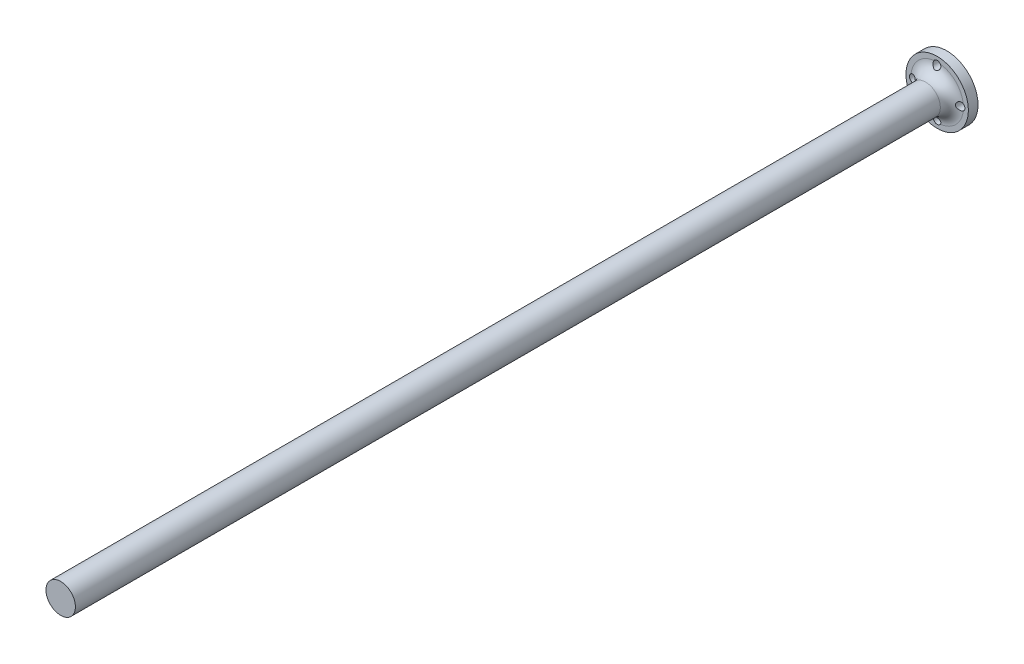
ISO-10303-21;
HEADER;
FILE_DESCRIPTION(('STEP AP214'),'2;1');
FILE_NAME('part.step','',(''),(''),'','','');
FILE_SCHEMA(('AUTOMOTIVE_DESIGN { 1 0 10303 214 1 1 1 1 }'));
ENDSEC;
DATA;
#1=APPLICATION_CONTEXT('core data for automotive mechanical design processes');
#2=APPLICATION_PROTOCOL_DEFINITION('international standard','automotive_design',2000,#1);
#3=PRODUCT_CONTEXT('',#1,'mechanical');
#4=PRODUCT('Part','Part','',(#3));
#5=PRODUCT_RELATED_PRODUCT_CATEGORY('part','',(#4));
#6=PRODUCT_DEFINITION_FORMATION('','',#4);
#7=PRODUCT_DEFINITION_CONTEXT('part definition',#1,'design');
#8=PRODUCT_DEFINITION('design','',#6,#7);
#9=PRODUCT_DEFINITION_SHAPE('','',#8);
#10=(LENGTH_UNIT() NAMED_UNIT(*) SI_UNIT(.MILLI.,.METRE.));
#11=(NAMED_UNIT(*) PLANE_ANGLE_UNIT() SI_UNIT($,.RADIAN.));
#12=(NAMED_UNIT(*) SI_UNIT($,.STERADIAN.) SOLID_ANGLE_UNIT());
#13=UNCERTAINTY_MEASURE_WITH_UNIT(LENGTH_MEASURE(1.E-05),#10,'distance_accuracy_value','');
#14=(GEOMETRIC_REPRESENTATION_CONTEXT(3) GLOBAL_UNCERTAINTY_ASSIGNED_CONTEXT((#13)) GLOBAL_UNIT_ASSIGNED_CONTEXT((#10,
#11,#12)) REPRESENTATION_CONTEXT('',''));
#15=CARTESIAN_POINT('',(0.,0.,0.));
#16=DIRECTION('',(0.,0.,1.));
#17=DIRECTION('',(1.,0.,0.));
#18=AXIS2_PLACEMENT_3D('',#15,#16,#17);
#19=CARTESIAN_POINT('',(0.,0.,3.175));
#20=DIRECTION('',(0.,0.,-1.));
#21=DIRECTION('',(-1.,0.,0.));
#22=AXIS2_PLACEMENT_3D('',#19,#20,#21);
#23=CYLINDRICAL_SURFACE('',#22,10.287);
#24=CARTESIAN_POINT('',(0.,0.,3.175));
#25=DIRECTION('',(0.,0.,1.));
#26=DIRECTION('',(1.,0.,0.));
#27=AXIS2_PLACEMENT_3D('',#24,#25,#26);
#28=CIRCLE('',#27,10.287);
#29=CARTESIAN_POINT('',(10.287,0.,3.175));
#30=VERTEX_POINT('',#29);
#31=EDGE_CURVE('E185',#30,#30,#28,.T.);
#32=ORIENTED_EDGE('',*,*,#31,.F.);
#33=EDGE_LOOP('',(#32));
#34=FACE_BOUND('',#33,.T.);
#35=CARTESIAN_POINT('',(0.,0.,0.));
#36=DIRECTION('',(0.,0.,1.));
#37=DIRECTION('',(1.,0.,0.));
#38=AXIS2_PLACEMENT_3D('',#35,#36,#37);
#39=CIRCLE('',#38,10.287);
#40=CARTESIAN_POINT('',(10.287,0.,0.));
#41=VERTEX_POINT('',#40);
#42=EDGE_CURVE('E190',#41,#41,#39,.T.);
#43=ORIENTED_EDGE('',*,*,#42,.T.);
#44=EDGE_LOOP('',(#43));
#45=FACE_BOUND('',#44,.T.);
#46=ADVANCED_FACE('F39',(#34,#45),#23,.T.);
#47=CARTESIAN_POINT('',(0.,0.,3.175));
#48=DIRECTION('',(0.,0.,1.));
#49=DIRECTION('',(1.,0.,0.));
#50=AXIS2_PLACEMENT_3D('',#47,#48,#49);
#51=PLANE('',#50);
#52=CARTESIAN_POINT('',(0.,-7.874,3.17499999999998));
#53=DIRECTION('',(0.,0.,1.));
#54=DIRECTION('',(1.,0.,0.));
#55=AXIS2_PLACEMENT_3D('',#52,#53,#54);
#56=CIRCLE('',#55,1.27);
#57=CARTESIAN_POINT('',(1.0431759884384,-8.59835064516129,3.17499999999998));
#58=VERTEX_POINT('',#57);
#59=CARTESIAN_POINT('',(-1.0431759884384,-8.59835064516129,3.17499999999998));
#60=VERTEX_POINT('',#59);
#61=EDGE_CURVE('E218',#58,#60,#56,.F.);
#62=ORIENTED_EDGE('',*,*,#61,.T.);
#63=CARTESIAN_POINT('',(0.,0.,3.175));
#64=DIRECTION('',(0.,0.,1.));
#65=DIRECTION('',(1.,0.,0.));
#66=AXIS2_PLACEMENT_3D('',#63,#64,#65);
#67=CIRCLE('',#66,8.6614);
#68=CARTESIAN_POINT('',(-8.5983506451613,-1.04317598843831,3.17499999999998));
#69=VERTEX_POINT('',#68);
#70=EDGE_CURVE('E121',#60,#69,#67,.F.);
#71=ORIENTED_EDGE('',*,*,#70,.T.);
#72=CARTESIAN_POINT('',(-7.874,0.,3.17499999999998));
#73=DIRECTION('',(0.,0.,1.));
#74=DIRECTION('',(1.,0.,0.));
#75=AXIS2_PLACEMENT_3D('',#72,#73,#74);
#76=CIRCLE('',#75,1.27);
#77=CARTESIAN_POINT('',(-8.59835064516128,1.04317598843849,3.17499999999998));
#78=VERTEX_POINT('',#77);
#79=EDGE_CURVE('E211',#69,#78,#76,.F.);
#80=ORIENTED_EDGE('',*,*,#79,.T.);
#81=CARTESIAN_POINT('',(0.,0.,3.175));
#82=DIRECTION('',(0.,0.,1.));
#83=DIRECTION('',(1.,0.,0.));
#84=AXIS2_PLACEMENT_3D('',#81,#82,#83);
#85=CIRCLE('',#84,8.6614);
#86=CARTESIAN_POINT('',(-1.0431759884384,8.59835064516129,3.17499999999998));
#87=VERTEX_POINT('',#86);
#88=EDGE_CURVE('E67',#78,#87,#85,.F.);
#89=ORIENTED_EDGE('',*,*,#88,.T.);
#90=CARTESIAN_POINT('',(0.,7.874,3.17499999999998));
#91=DIRECTION('',(0.,0.,1.));
#92=DIRECTION('',(1.,0.,0.));
#93=AXIS2_PLACEMENT_3D('',#90,#91,#92);
#94=CIRCLE('',#93,1.27);
#95=CARTESIAN_POINT('',(1.0431759884384,8.59835064516129,3.17499999999998));
#96=VERTEX_POINT('',#95);
#97=EDGE_CURVE('E205',#87,#96,#94,.F.);
#98=ORIENTED_EDGE('',*,*,#97,.T.);
#99=CARTESIAN_POINT('',(0.,0.,3.175));
#100=DIRECTION('',(0.,0.,1.));
#101=DIRECTION('',(1.,0.,0.));
#102=AXIS2_PLACEMENT_3D('',#99,#100,#101);
#103=CIRCLE('',#102,8.6614);
#104=CARTESIAN_POINT('',(8.59835064516129,1.04317598843837,3.17499999999998));
#105=VERTEX_POINT('',#104);
#106=EDGE_CURVE('E100',#96,#105,#103,.F.);
#107=ORIENTED_EDGE('',*,*,#106,.T.);
#108=CARTESIAN_POINT('',(7.874,0.,3.17499999999998));
#109=DIRECTION('',(0.,0.,1.));
#110=DIRECTION('',(1.,0.,0.));
#111=AXIS2_PLACEMENT_3D('',#108,#109,#110);
#112=CIRCLE('',#111,1.27);
#113=CARTESIAN_POINT('',(8.59835064516129,-1.04317598843843,3.17499999999998));
#114=VERTEX_POINT('',#113);
#115=EDGE_CURVE('E90',#105,#114,#112,.F.);
#116=ORIENTED_EDGE('',*,*,#115,.T.);
#117=CARTESIAN_POINT('',(0.,0.,3.175));
#118=DIRECTION('',(0.,0.,1.));
#119=DIRECTION('',(1.,0.,0.));
#120=AXIS2_PLACEMENT_3D('',#117,#118,#119);
#121=CIRCLE('',#120,8.6614);
#122=EDGE_CURVE('E98',#114,#58,#121,.F.);
#123=ORIENTED_EDGE('',*,*,#122,.T.);
#124=EDGE_LOOP('',(#62,#71,#80,#89,#98,#107,#116,#123));
#125=FACE_BOUND('',#124,.T.);
#126=ORIENTED_EDGE('',*,*,#31,.T.);
#127=EDGE_LOOP('',(#126));
#128=FACE_BOUND('',#127,.T.);
#129=ADVANCED_FACE('F96',(#125,#128),#51,.T.);
#130=CARTESIAN_POINT('',(0.,0.,0.));
#131=DIRECTION('',(0.,0.,1.));
#132=DIRECTION('',(1.,0.,0.));
#133=AXIS2_PLACEMENT_3D('',#130,#131,#132);
#134=PLANE('',#133);
#135=CARTESIAN_POINT('',(7.874,0.,0.));
#136=DIRECTION('',(0.,0.,-1.));
#137=DIRECTION('',(0.,1.,0.));
#138=AXIS2_PLACEMENT_3D('',#135,#136,#137);
#139=CIRCLE('',#138,1.27);
#140=CARTESIAN_POINT('',(7.874,1.26999999999997,0.));
#141=VERTEX_POINT('',#140);
#142=EDGE_CURVE('E102',#141,#141,#139,.T.);
#143=ORIENTED_EDGE('',*,*,#142,.F.);
#144=EDGE_LOOP('',(#143));
#145=FACE_BOUND('',#144,.T.);
#146=CARTESIAN_POINT('',(0.,-7.874,0.));
#147=DIRECTION('',(0.,0.,-1.));
#148=DIRECTION('',(1.,0.,0.));
#149=AXIS2_PLACEMENT_3D('',#146,#147,#148);
#150=CIRCLE('',#149,1.27);
#151=CARTESIAN_POINT('',(1.27,-7.874,0.));
#152=VERTEX_POINT('',#151);
#153=EDGE_CURVE('E103',#152,#152,#150,.T.);
#154=ORIENTED_EDGE('',*,*,#153,.F.);
#155=EDGE_LOOP('',(#154));
#156=FACE_BOUND('',#155,.T.);
#157=CARTESIAN_POINT('',(-7.874,0.,0.));
#158=DIRECTION('',(0.,0.,-1.));
#159=DIRECTION('',(0.,-1.,0.));
#160=AXIS2_PLACEMENT_3D('',#157,#158,#159);
#161=CIRCLE('',#160,1.27);
#162=CARTESIAN_POINT('',(-7.87400000000001,-1.26999999999992,0.));
#163=VERTEX_POINT('',#162);
#164=EDGE_CURVE('E214',#163,#163,#161,.T.);
#165=ORIENTED_EDGE('',*,*,#164,.F.);
#166=EDGE_LOOP('',(#165));
#167=FACE_BOUND('',#166,.T.);
#168=CARTESIAN_POINT('',(0.,7.874,0.));
#169=DIRECTION('',(0.,0.,-1.));
#170=DIRECTION('',(-1.,0.,0.));
#171=AXIS2_PLACEMENT_3D('',#168,#169,#170);
#172=CIRCLE('',#171,1.27);
#173=CARTESIAN_POINT('',(-1.27,7.874,0.));
#174=VERTEX_POINT('',#173);
#175=EDGE_CURVE('E204',#174,#174,#172,.T.);
#176=ORIENTED_EDGE('',*,*,#175,.F.);
#177=EDGE_LOOP('',(#176));
#178=FACE_BOUND('',#177,.T.);
#179=CARTESIAN_POINT('',(0.,0.,0.));
#180=DIRECTION('',(0.,0.,1.));
#181=DIRECTION('',(1.,0.,0.));
#182=AXIS2_PLACEMENT_3D('',#179,#180,#181);
#183=CIRCLE('',#182,5.064000032);
#184=CARTESIAN_POINT('',(5.064000032,0.,0.));
#185=VERTEX_POINT('',#184);
#186=EDGE_CURVE('E115',#185,#185,#183,.T.);
#187=ORIENTED_EDGE('',*,*,#186,.T.);
#188=EDGE_LOOP('',(#187));
#189=FACE_BOUND('',#188,.T.);
#190=ORIENTED_EDGE('',*,*,#42,.F.);
#191=EDGE_LOOP('',(#190));
#192=FACE_BOUND('',#191,.T.);
#193=ADVANCED_FACE('F165',(#145,#156,#167,#178,#189,#192),#134,.F.);
#194=CARTESIAN_POINT('',(0.,0.,292.1));
#195=DIRECTION('',(0.,0.,-1.));
#196=DIRECTION('',(-1.,0.,0.));
#197=AXIS2_PLACEMENT_3D('',#194,#195,#196);
#198=CYLINDRICAL_SURFACE('',#197,4.8514);
#199=CARTESIAN_POINT('',(0.,0.,6.98500000000002));
#200=DIRECTION('',(0.,0.,1.));
#201=DIRECTION('',(1.,0.,0.));
#202=AXIS2_PLACEMENT_3D('',#199,#200,#201);
#203=CIRCLE('',#202,4.8514);
#204=CARTESIAN_POINT('',(4.8514,0.,6.98500000000002));
#205=VERTEX_POINT('',#204);
#206=EDGE_CURVE('E109',#205,#205,#203,.T.);
#207=ORIENTED_EDGE('',*,*,#206,.T.);
#208=EDGE_LOOP('',(#207));
#209=FACE_BOUND('',#208,.T.);
#210=CARTESIAN_POINT('',(0.,0.,292.1));
#211=DIRECTION('',(0.,0.,1.));
#212=DIRECTION('',(1.,0.,0.));
#213=AXIS2_PLACEMENT_3D('',#210,#211,#212);
#214=CIRCLE('',#213,4.8514);
#215=CARTESIAN_POINT('',(4.8514,0.,292.1));
#216=VERTEX_POINT('',#215);
#217=EDGE_CURVE('E195',#216,#216,#214,.T.);
#218=ORIENTED_EDGE('',*,*,#217,.F.);
#219=EDGE_LOOP('',(#218));
#220=FACE_BOUND('',#219,.T.);
#221=ADVANCED_FACE('F161',(#209,#220),#198,.T.);
#222=CARTESIAN_POINT('',(0.,0.,292.1));
#223=DIRECTION('',(0.,0.,1.));
#224=DIRECTION('',(1.,0.,0.));
#225=AXIS2_PLACEMENT_3D('',#222,#223,#224);
#226=PLANE('',#225);
#227=ORIENTED_EDGE('',*,*,#217,.T.);
#228=EDGE_LOOP('',(#227));
#229=FACE_BOUND('',#228,.T.);
#230=ADVANCED_FACE('F157',(#229),#226,.T.);
#231=CARTESIAN_POINT('',(0.,0.,1.27));
#232=DIRECTION('',(0.,0.,-1.));
#233=DIRECTION('',(-1.,0.,0.));
#234=AXIS2_PLACEMENT_3D('',#231,#232,#233);
#235=CYLINDRICAL_SURFACE('',#234,4.064);
#236=CARTESIAN_POINT('',(0.,0.,1.000000032));
#237=DIRECTION('',(0.,0.,1.));
#238=DIRECTION('',(1.,0.,0.));
#239=AXIS2_PLACEMENT_3D('',#236,#237,#238);
#240=CIRCLE('',#239,4.064);
#241=CARTESIAN_POINT('',(4.064,0.,1.000000032));
#242=VERTEX_POINT('',#241);
#243=EDGE_CURVE('E183',#242,#242,#240,.F.);
#244=ORIENTED_EDGE('',*,*,#243,.T.);
#245=EDGE_LOOP('',(#244));
#246=FACE_BOUND('',#245,.T.);
#247=CARTESIAN_POINT('',(0.,0.,1.27));
#248=DIRECTION('',(0.,0.,-1.));
#249=DIRECTION('',(-1.,0.,0.));
#250=AXIS2_PLACEMENT_3D('',#247,#248,#249);
#251=CIRCLE('',#250,4.064);
#252=CARTESIAN_POINT('',(-4.064,0.,1.27));
#253=VERTEX_POINT('',#252);
#254=EDGE_CURVE('E200',#253,#253,#251,.T.);
#255=ORIENTED_EDGE('',*,*,#254,.F.);
#256=EDGE_LOOP('',(#255));
#257=FACE_BOUND('',#256,.T.);
#258=ADVANCED_FACE('F153',(#246,#257),#235,.F.);
#259=CARTESIAN_POINT('',(0.,0.,1.27));
#260=DIRECTION('',(0.,0.,-1.));
#261=DIRECTION('',(-1.,0.,0.));
#262=AXIS2_PLACEMENT_3D('',#259,#260,#261);
#263=PLANE('',#262);
#264=ORIENTED_EDGE('',*,*,#254,.T.);
#265=EDGE_LOOP('',(#264));
#266=FACE_BOUND('',#265,.T.);
#267=ADVANCED_FACE('F150',(#266),#263,.T.);
#268=CARTESIAN_POINT('',(0.,0.,1.000000032));
#269=DIRECTION('',(0.,0.,1.));
#270=DIRECTION('',(1.,0.,0.));
#271=AXIS2_PLACEMENT_3D('',#268,#269,#270);
#272=TOROIDAL_SURFACE('',#271,5.064000032,1.000000032);
#273=ORIENTED_EDGE('',*,*,#186,.F.);
#274=EDGE_LOOP('',(#273));
#275=FACE_BOUND('',#274,.T.);
#276=ORIENTED_EDGE('',*,*,#243,.F.);
#277=EDGE_LOOP('',(#276));
#278=FACE_BOUND('',#277,.T.);
#279=ADVANCED_FACE('F149',(#275,#278),#272,.T.);
#280=CARTESIAN_POINT('',(0.,7.874,292.101));
#281=DIRECTION('',(0.,0.,-1.));
#282=DIRECTION('',(-1.,0.,0.));
#283=AXIS2_PLACEMENT_3D('',#280,#281,#282);
#284=CYLINDRICAL_SURFACE('',#283,1.27);
#285=ORIENTED_EDGE('',*,*,#97,.F.);
#286=CARTESIAN_POINT('',(-1.0431759884384,8.59835064516129,3.17499999999998));
#287=CARTESIAN_POINT('',(-1.06289640384542,8.56995029152603,3.17500012497616));
#288=CARTESIAN_POINT('',(-1.08144751337721,8.54075637923846,3.17526278025348));
#289=CARTESIAN_POINT('',(-1.11610598325247,8.48096204710665,3.1764132595146));
#290=CARTESIAN_POINT('',(-1.1322131944261,8.45036154155566,3.17730112164091));
#291=CARTESIAN_POINT('',(-1.17665908328575,8.35682906758126,3.1810485481604));
#292=CARTESIAN_POINT('',(-1.20118754623718,8.29207154943508,3.18499129871878));
#293=CARTESIAN_POINT('',(-1.23937333594761,8.15967741101565,3.19640521961439));
#294=CARTESIAN_POINT('',(-1.25301869409892,8.09203770692676,3.20388026021777));
#295=CARTESIAN_POINT('',(-1.26919741736911,7.95600544339672,3.22272333572229));
#296=CARTESIAN_POINT('',(-1.27173608464808,7.88761325881432,3.23408951026216));
#297=CARTESIAN_POINT('',(-1.26597113979908,7.7524878194325,3.26065445449193));
#298=CARTESIAN_POINT('',(-1.25773263291248,7.68574706210172,3.27582976694737));
#299=CARTESIAN_POINT('',(-1.23114959105762,7.55523688459311,3.30971019066797));
#300=CARTESIAN_POINT('',(-1.2128009232718,7.49146869110538,3.32841674337146));
#301=CARTESIAN_POINT('',(-1.16583074654298,7.36562168221175,3.3695864033683));
#302=CARTESIAN_POINT('',(-1.13679106426351,7.30374208391573,3.39217899489022));
#303=CARTESIAN_POINT('',(-1.069638496787,7.18597790009636,3.439433463826));
#304=CARTESIAN_POINT('',(-1.03152057632118,7.13009666662427,3.46409648467579));
#305=CARTESIAN_POINT('',(-0.943342198601124,7.02054494397463,3.51640421878701));
#306=CARTESIAN_POINT('',(-0.892517485191314,6.96752169124923,3.54411803060305));
#307=CARTESIAN_POINT('',(-0.782121113437466,6.87071770434732,3.59831666570663));
#308=CARTESIAN_POINT('',(-0.722549900366142,6.8269364999468,3.62480155146689));
#309=CARTESIAN_POINT('',(-0.604696117199531,6.75539198852042,3.67038818635135));
#310=CARTESIAN_POINT('',(-0.547464383416171,6.72622970837761,3.69000389898327));
#311=CARTESIAN_POINT('',(-0.428027805107329,6.67655921167778,3.72449416622957));
#312=CARTESIAN_POINT('',(-0.365828304390262,6.65604184107849,3.73937373181602));
#313=CARTESIAN_POINT('',(-0.237219570821197,6.62458436212616,3.76257595455986));
#314=CARTESIAN_POINT('',(-0.17077859058058,6.61372859145768,3.77084080912167));
#315=CARTESIAN_POINT('',(-0.0365207644427127,6.60274479469963,3.77920359420748));
#316=CARTESIAN_POINT('',(0.0312948191960361,6.60260733627995,3.77930870546912));
#317=CARTESIAN_POINT('',(0.156098203894802,6.61229779321421,3.77193019711515));
#318=CARTESIAN_POINT('',(0.213268189895171,6.62072777820644,3.76551110672285));
#319=CARTESIAN_POINT('',(0.32515746954598,6.64499548241012,3.74747458430372));
#320=CARTESIAN_POINT('',(0.379875597568722,6.66083668486159,3.73585470804149));
#321=CARTESIAN_POINT('',(0.48817989065699,6.70009684440954,3.70801145456806));
#322=CARTESIAN_POINT('',(0.541605916974506,6.72382308792778,3.69160539523385));
#323=CARTESIAN_POINT('',(0.643959696947325,6.7778389636094,3.65588491901623));
#324=CARTESIAN_POINT('',(0.692885363088502,6.80813161998588,3.63656916330392));
#325=CARTESIAN_POINT('',(0.794804551205414,6.88110635657907,3.59244316178506));
#326=CARTESIAN_POINT('',(0.846749239127414,6.92505174535407,3.5672935016735));
#327=CARTESIAN_POINT('',(0.942929352300184,7.02054692703142,3.516610306199));
#328=CARTESIAN_POINT('',(0.987158899509944,7.07210246325002,3.49107649410564));
#329=CARTESIAN_POINT('',(1.07179048779895,7.18848695321923,3.43825110692108));
#330=CARTESIAN_POINT('',(1.11112917720187,7.25416398475417,3.41110640909663));
#331=CARTESIAN_POINT('',(1.17771144914676,7.39256012118627,3.36008702880932));
#332=CARTESIAN_POINT('',(1.20495907263197,7.46527686343628,3.33621125568974));
#333=CARTESIAN_POINT('',(1.2449788656178,7.6123376379078,3.29400627576007));
#334=CARTESIAN_POINT('',(1.2583498319686,7.68645943438405,3.27547509414826));
#335=CARTESIAN_POINT('',(1.27169927335957,7.83692637113856,3.24323713917579));
#336=CARTESIAN_POINT('',(1.27168490592673,7.91327030133697,3.22952779136403));
#337=CARTESIAN_POINT('',(1.25841716515348,8.05883973506362,3.20798267444852));
#338=CARTESIAN_POINT('',(1.24630365666409,8.12811223619367,3.19974285234582));
#339=CARTESIAN_POINT('',(1.21066862890772,8.26400514570624,3.18701654672277));
#340=CARTESIAN_POINT('',(1.18715487886044,8.33062732686189,3.18252751272092));
#341=CARTESIAN_POINT('',(1.14227268409615,8.43045707193954,3.17796576741972));
#342=CARTESIAN_POINT('',(1.12461125844486,8.46533388170446,3.17681661350201));
#343=CARTESIAN_POINT('',(1.08618413709123,8.53325946844161,3.17533441127652));
#344=CARTESIAN_POINT('',(1.06542474831647,8.56631177672281,3.17499972826377));
#345=CARTESIAN_POINT('',(1.04317598843839,8.59835064516129,3.17500000000002));
#346=B_SPLINE_CURVE_WITH_KNOTS('',3,(#286,#287,#288,#289,#290,#291,#292,#293,#294,#295,#296,
#297,#298,#299,#300,#301,#302,#303,#304,#305,#306,#307,#308,#309,#310,#311,#312,#313,#314,#315,
#316,#317,#318,#319,#320,#321,#322,#323,#324,#325,#326,#327,#328,#329,#330,#331,#332,#333,#334,
#335,#336,#337,#338,#339,#340,#341,#342,#343,#344,#345),.UNSPECIFIED.,.F.,.F.,(4,2,2,2,2,2,2,2,
2,2,2,2,2,2,2,2,2,2,2,2,2,2,2,2,2,2,2,2,2,4),(0.,0.103666190456844,0.207338705912478,
0.414342861060912,0.621574354681815,0.828706908434547,1.03459392808994,1.24056517246143,
1.45563940414784,1.67083320628739,1.90531770590207,2.13979027235779,2.34048206330813,
2.54096080559671,2.74317286556763,2.94520697285342,3.1188449325027,3.29256458334965,
3.47405550670877,3.65563019541232,3.87238933874952,4.08931291283225,4.33177036377404,
4.57414672210807,4.80556415171087,5.03685783575972,5.2482392308555,5.45947677242264,
5.576653238689,5.69359432820839),.UNSPECIFIED.);
#347=EDGE_CURVE('E60',#87,#96,#346,.T.);
#348=ORIENTED_EDGE('',*,*,#347,.T.);
#349=EDGE_LOOP('',(#285,#348));
#350=FACE_BOUND('',#349,.T.);
#351=ORIENTED_EDGE('',*,*,#175,.T.);
#352=EDGE_LOOP('',(#351));
#353=FACE_BOUND('',#352,.T.);
#354=ADVANCED_FACE('F142',(#350,#353),#284,.F.);
#355=CARTESIAN_POINT('',(-7.874,0.,292.101));
#356=DIRECTION('',(0.,0.,-1.));
#357=DIRECTION('',(-1.,0.,0.));
#358=AXIS2_PLACEMENT_3D('',#355,#356,#357);
#359=CYLINDRICAL_SURFACE('',#358,1.27);
#360=ORIENTED_EDGE('',*,*,#79,.F.);
#361=CARTESIAN_POINT('',(-8.5983506451613,-1.04317598843831,3.17499999999998));
#362=CARTESIAN_POINT('',(-8.56995029152604,-1.06289640384533,3.17500012497616));
#363=CARTESIAN_POINT('',(-8.54075637923847,-1.08144751337712,3.17526278025348));
#364=CARTESIAN_POINT('',(-8.48096204710666,-1.11610598325238,3.1764132595146));
#365=CARTESIAN_POINT('',(-8.45036154155567,-1.13221319442601,3.17730112164091));
#366=CARTESIAN_POINT('',(-8.35682906758128,-1.17665908328566,3.1810485481604));
#367=CARTESIAN_POINT('',(-8.29207154943509,-1.20118754623709,3.18499129871878));
#368=CARTESIAN_POINT('',(-8.15967741101566,-1.23937333594752,3.19640521961439));
#369=CARTESIAN_POINT('',(-8.09203770692678,-1.25301869409883,3.20388026021777));
#370=CARTESIAN_POINT('',(-7.95600544339673,-1.26919741736903,3.22272333572229));
#371=CARTESIAN_POINT('',(-7.88761325881433,-1.27173608464799,3.23408951026216));
#372=CARTESIAN_POINT('',(-7.75248781943251,-1.265971139799,3.26065445449193));
#373=CARTESIAN_POINT('',(-7.68574706210173,-1.2577326329124,3.27582976694737));
#374=CARTESIAN_POINT('',(-7.55523688459312,-1.23114959105754,3.30971019066797));
#375=CARTESIAN_POINT('',(-7.49146869110539,-1.21280092327172,3.32841674337146));
#376=CARTESIAN_POINT('',(-7.36562168221176,-1.16583074654291,3.3695864033683));
#377=CARTESIAN_POINT('',(-7.30374208391574,-1.13679106426343,3.39217899489023));
#378=CARTESIAN_POINT('',(-7.18597790009637,-1.06963849678693,3.439433463826));
#379=CARTESIAN_POINT('',(-7.13009666662428,-1.03152057632111,3.46409648467579));
#380=CARTESIAN_POINT('',(-7.02054494397464,-0.94334219860105,3.51640421878701));
#381=CARTESIAN_POINT('',(-6.96752169124924,-0.89251748519124,3.54411803060305));
#382=CARTESIAN_POINT('',(-6.87071770434733,-0.782121113437393,3.59831666570663));
#383=CARTESIAN_POINT('',(-6.82693649994681,-0.72254990036607,3.62480155146689));
#384=CARTESIAN_POINT('',(-6.75539198852043,-0.604696117199459,3.67038818635135));
#385=CARTESIAN_POINT('',(-6.72622970837761,-0.547464383416099,3.69000389898327));
#386=CARTESIAN_POINT('',(-6.67655921167778,-0.428027805107258,3.72449416622957));
#387=CARTESIAN_POINT('',(-6.65604184107849,-0.365828304390192,3.73937373181602));
#388=CARTESIAN_POINT('',(-6.62458436212616,-0.237219570821127,3.76257595455986));
#389=CARTESIAN_POINT('',(-6.61372859145768,-0.17077859058051,3.77084080912167));
#390=CARTESIAN_POINT('',(-6.60274479469963,-0.0365207644426434,3.77920359420748));
#391=CARTESIAN_POINT('',(-6.60260733627995,0.0312948191961052,3.77930870546913));
#392=CARTESIAN_POINT('',(-6.6122977932142,0.156098203894871,3.77193019711515));
#393=CARTESIAN_POINT('',(-6.62072777820643,0.21326818989524,3.76551110672285));
#394=CARTESIAN_POINT('',(-6.64499548241012,0.325157469546049,3.74747458430372));
#395=CARTESIAN_POINT('',(-6.66083668486159,0.379875597568792,3.73585470804149));
#396=CARTESIAN_POINT('',(-6.70009684440953,0.48817989065706,3.70801145456806));
#397=CARTESIAN_POINT('',(-6.72382308792777,0.541605916974577,3.69160539523384));
#398=CARTESIAN_POINT('',(-6.7778389636094,0.643959696947396,3.65588491901623));
#399=CARTESIAN_POINT('',(-6.80813161998588,0.692885363088574,3.63656916330392));
#400=CARTESIAN_POINT('',(-6.88110635657906,0.794804551205486,3.59244316178506));
#401=CARTESIAN_POINT('',(-6.92505174535406,0.846749239127486,3.5672935016735));
#402=CARTESIAN_POINT('',(-7.02054692703141,0.942929352300257,3.516610306199));
#403=CARTESIAN_POINT('',(-7.07210246325001,0.987158899510018,3.49107649410564));
#404=CARTESIAN_POINT('',(-7.18848695321921,1.07179048779903,3.43825110692108));
#405=CARTESIAN_POINT('',(-7.25416398475415,1.11112917720195,3.41110640909663));
#406=CARTESIAN_POINT('',(-7.39256012118626,1.17771144914683,3.36008702880932));
#407=CARTESIAN_POINT('',(-7.46527686343626,1.20495907263205,3.33621125568974));
#408=CARTESIAN_POINT('',(-7.61233763790779,1.24497886561788,3.29400627576006));
#409=CARTESIAN_POINT('',(-7.68645943438403,1.25834983196868,3.27547509414826));
#410=CARTESIAN_POINT('',(-7.83692637113855,1.27169927335965,3.24323713917579));
#411=CARTESIAN_POINT('',(-7.91327030133696,1.27168490592681,3.22952779136403));
#412=CARTESIAN_POINT('',(-8.05883973506361,1.25841716515357,3.20798267444852));
#413=CARTESIAN_POINT('',(-8.12811223619365,1.24630365666417,3.19974285234582));
#414=CARTESIAN_POINT('',(-8.26400514570623,1.21066862890781,3.18701654672277));
#415=CARTESIAN_POINT('',(-8.33062732686188,1.18715487886052,3.18252751272092));
#416=CARTESIAN_POINT('',(-8.43045707193953,1.14227268409624,3.17796576741972));
#417=CARTESIAN_POINT('',(-8.46533388170444,1.12461125844495,3.17681661350201));
#418=CARTESIAN_POINT('',(-8.5332594684416,1.08618413709132,3.17533441127652));
#419=CARTESIAN_POINT('',(-8.5663117767228,1.06542474831656,3.17499972826377));
#420=CARTESIAN_POINT('',(-8.59835064516128,1.04317598843848,3.17500000000002));
#421=B_SPLINE_CURVE_WITH_KNOTS('',3,(#361,#362,#363,#364,#365,#366,#367,#368,#369,#370,#371,
#372,#373,#374,#375,#376,#377,#378,#379,#380,#381,#382,#383,#384,#385,#386,#387,#388,#389,#390,
#391,#392,#393,#394,#395,#396,#397,#398,#399,#400,#401,#402,#403,#404,#405,#406,#407,#408,#409,
#410,#411,#412,#413,#414,#415,#416,#417,#418,#419,#420),.UNSPECIFIED.,.F.,.F.,(4,2,2,2,2,2,2,2,
2,2,2,2,2,2,2,2,2,2,2,2,2,2,2,2,2,2,2,2,2,4),(0.,0.103666190456844,0.20733870591248,
0.414342861060912,0.621574354681814,0.828706908434547,1.03459392808994,1.24056517246143,
1.45563940414784,1.67083320628739,1.90531770590207,2.13979027235779,2.34048206330813,
2.54096080559671,2.74317286556763,2.94520697285342,3.1188449325027,3.29256458334965,
3.47405550670877,3.65563019541232,3.87238933874952,4.08931291283224,4.33177036377404,
4.57414672210807,4.80556415171087,5.03685783575973,5.2482392308555,5.45947677242264,
5.576653238689,5.69359432820839),.UNSPECIFIED.);
#422=EDGE_CURVE('E125',#69,#78,#421,.T.);
#423=ORIENTED_EDGE('',*,*,#422,.T.);
#424=EDGE_LOOP('',(#360,#423));
#425=FACE_BOUND('',#424,.T.);
#426=ORIENTED_EDGE('',*,*,#164,.T.);
#427=EDGE_LOOP('',(#426));
#428=FACE_BOUND('',#427,.T.);
#429=ADVANCED_FACE('F138',(#425,#428),#359,.F.);
#430=CARTESIAN_POINT('',(0.,-7.874,292.101));
#431=DIRECTION('',(0.,0.,-1.));
#432=DIRECTION('',(-1.,0.,0.));
#433=AXIS2_PLACEMENT_3D('',#430,#431,#432);
#434=CYLINDRICAL_SURFACE('',#433,1.27);
#435=ORIENTED_EDGE('',*,*,#61,.F.);
#436=CARTESIAN_POINT('',(1.0431759884384,-8.59835064516129,3.17499999999998));
#437=CARTESIAN_POINT('',(1.06289640384542,-8.56995029152603,3.17500012497616));
#438=CARTESIAN_POINT('',(1.08144751337721,-8.54075637923846,3.17526278025348));
#439=CARTESIAN_POINT('',(1.11610598325247,-8.48096204710665,3.1764132595146));
#440=CARTESIAN_POINT('',(1.1322131944261,-8.45036154155566,3.17730112164091));
#441=CARTESIAN_POINT('',(1.17665908328575,-8.35682906758126,3.1810485481604));
#442=CARTESIAN_POINT('',(1.20118754623718,-8.29207154943508,3.18499129871878));
#443=CARTESIAN_POINT('',(1.23937333594761,-8.15967741101565,3.19640521961439));
#444=CARTESIAN_POINT('',(1.25301869409892,-8.09203770692676,3.20388026021777));
#445=CARTESIAN_POINT('',(1.26919741736911,-7.95600544339672,3.22272333572229));
#446=CARTESIAN_POINT('',(1.27173608464808,-7.88761325881432,3.23408951026216));
#447=CARTESIAN_POINT('',(1.26597113979908,-7.7524878194325,3.26065445449193));
#448=CARTESIAN_POINT('',(1.25773263291248,-7.68574706210172,3.27582976694737));
#449=CARTESIAN_POINT('',(1.23114959105762,-7.55523688459311,3.30971019066797));
#450=CARTESIAN_POINT('',(1.2128009232718,-7.49146869110538,3.32841674337146));
#451=CARTESIAN_POINT('',(1.16583074654298,-7.36562168221175,3.3695864033683));
#452=CARTESIAN_POINT('',(1.13679106426351,-7.30374208391573,3.39217899489022));
#453=CARTESIAN_POINT('',(1.069638496787,-7.18597790009636,3.439433463826));
#454=CARTESIAN_POINT('',(1.03152057632118,-7.13009666662427,3.46409648467579));
#455=CARTESIAN_POINT('',(0.943342198601124,-7.02054494397463,3.51640421878701));
#456=CARTESIAN_POINT('',(0.892517485191314,-6.96752169124923,3.54411803060305));
#457=CARTESIAN_POINT('',(0.782121113437466,-6.87071770434732,3.59831666570663));
#458=CARTESIAN_POINT('',(0.722549900366142,-6.8269364999468,3.62480155146689));
#459=CARTESIAN_POINT('',(0.604696117199531,-6.75539198852042,3.67038818635135));
#460=CARTESIAN_POINT('',(0.547464383416171,-6.72622970837761,3.69000389898327));
#461=CARTESIAN_POINT('',(0.428027805107329,-6.67655921167778,3.72449416622957));
#462=CARTESIAN_POINT('',(0.365828304390262,-6.65604184107849,3.73937373181602));
#463=CARTESIAN_POINT('',(0.237219570821197,-6.62458436212616,3.76257595455986));
#464=CARTESIAN_POINT('',(0.17077859058058,-6.61372859145768,3.77084080912167));
#465=CARTESIAN_POINT('',(0.0365207644427127,-6.60274479469963,3.77920359420748));
#466=CARTESIAN_POINT('',(-0.0312948191960361,-6.60260733627995,3.77930870546912));
#467=CARTESIAN_POINT('',(-0.156098203894802,-6.61229779321421,3.77193019711515));
#468=CARTESIAN_POINT('',(-0.213268189895171,-6.62072777820644,3.76551110672285));
#469=CARTESIAN_POINT('',(-0.32515746954598,-6.64499548241012,3.74747458430372));
#470=CARTESIAN_POINT('',(-0.379875597568722,-6.66083668486159,3.73585470804149));
#471=CARTESIAN_POINT('',(-0.48817989065699,-6.70009684440954,3.70801145456806));
#472=CARTESIAN_POINT('',(-0.541605916974506,-6.72382308792778,3.69160539523385));
#473=CARTESIAN_POINT('',(-0.643959696947325,-6.7778389636094,3.65588491901623));
#474=CARTESIAN_POINT('',(-0.692885363088502,-6.80813161998588,3.63656916330392));
#475=CARTESIAN_POINT('',(-0.794804551205414,-6.88110635657907,3.59244316178506));
#476=CARTESIAN_POINT('',(-0.846749239127414,-6.92505174535407,3.5672935016735));
#477=CARTESIAN_POINT('',(-0.942929352300184,-7.02054692703142,3.516610306199));
#478=CARTESIAN_POINT('',(-0.987158899509944,-7.07210246325002,3.49107649410564));
#479=CARTESIAN_POINT('',(-1.07179048779895,-7.18848695321923,3.43825110692108));
#480=CARTESIAN_POINT('',(-1.11112917720187,-7.25416398475417,3.41110640909663));
#481=CARTESIAN_POINT('',(-1.17771144914676,-7.39256012118627,3.36008702880932));
#482=CARTESIAN_POINT('',(-1.20495907263197,-7.46527686343628,3.33621125568974));
#483=CARTESIAN_POINT('',(-1.2449788656178,-7.6123376379078,3.29400627576007));
#484=CARTESIAN_POINT('',(-1.2583498319686,-7.68645943438405,3.27547509414826));
#485=CARTESIAN_POINT('',(-1.27169927335957,-7.83692637113856,3.24323713917579));
#486=CARTESIAN_POINT('',(-1.27168490592673,-7.91327030133697,3.22952779136403));
#487=CARTESIAN_POINT('',(-1.25841716515348,-8.05883973506362,3.20798267444852));
#488=CARTESIAN_POINT('',(-1.24630365666409,-8.12811223619367,3.19974285234582));
#489=CARTESIAN_POINT('',(-1.21066862890772,-8.26400514570624,3.18701654672277));
#490=CARTESIAN_POINT('',(-1.18715487886044,-8.33062732686189,3.18252751272092));
#491=CARTESIAN_POINT('',(-1.14227268409615,-8.43045707193954,3.17796576741972));
#492=CARTESIAN_POINT('',(-1.12461125844486,-8.46533388170446,3.17681661350201));
#493=CARTESIAN_POINT('',(-1.08618413709123,-8.53325946844161,3.17533441127652));
#494=CARTESIAN_POINT('',(-1.06542474831647,-8.56631177672281,3.17499972826377));
#495=CARTESIAN_POINT('',(-1.04317598843839,-8.59835064516129,3.17500000000002));
#496=B_SPLINE_CURVE_WITH_KNOTS('',3,(#436,#437,#438,#439,#440,#441,#442,#443,#444,#445,#446,
#447,#448,#449,#450,#451,#452,#453,#454,#455,#456,#457,#458,#459,#460,#461,#462,#463,#464,#465,
#466,#467,#468,#469,#470,#471,#472,#473,#474,#475,#476,#477,#478,#479,#480,#481,#482,#483,#484,
#485,#486,#487,#488,#489,#490,#491,#492,#493,#494,#495),.UNSPECIFIED.,.F.,.F.,(4,2,2,2,2,2,2,2,
2,2,2,2,2,2,2,2,2,2,2,2,2,2,2,2,2,2,2,2,2,4),(0.,0.103666190456844,0.207338705912478,
0.414342861060912,0.621574354681815,0.828706908434547,1.03459392808994,1.24056517246143,
1.45563940414784,1.67083320628739,1.90531770590207,2.13979027235779,2.34048206330813,
2.54096080559671,2.74317286556763,2.94520697285342,3.1188449325027,3.29256458334965,
3.47405550670877,3.65563019541232,3.87238933874952,4.08931291283225,4.33177036377404,
4.57414672210807,4.80556415171087,5.03685783575972,5.2482392308555,5.45947677242264,
5.576653238689,5.69359432820839),.UNSPECIFIED.);
#497=EDGE_CURVE('E11',#58,#60,#496,.T.);
#498=ORIENTED_EDGE('',*,*,#497,.T.);
#499=EDGE_LOOP('',(#435,#498));
#500=FACE_BOUND('',#499,.T.);
#501=ORIENTED_EDGE('',*,*,#153,.T.);
#502=EDGE_LOOP('',(#501));
#503=FACE_BOUND('',#502,.T.);
#504=ADVANCED_FACE('F141',(#500,#503),#434,.F.);
#505=CARTESIAN_POINT('',(7.874,0.,292.101));
#506=DIRECTION('',(0.,0.,-1.));
#507=DIRECTION('',(-1.,0.,0.));
#508=AXIS2_PLACEMENT_3D('',#505,#506,#507);
#509=CYLINDRICAL_SURFACE('',#508,1.27);
#510=ORIENTED_EDGE('',*,*,#115,.F.);
#511=CARTESIAN_POINT('',(8.59835064516129,1.04317598843837,3.17499999999998));
#512=CARTESIAN_POINT('',(8.56995029152604,1.06289640384539,3.17500012497616));
#513=CARTESIAN_POINT('',(8.54075637923846,1.08144751337718,3.17526278025348));
#514=CARTESIAN_POINT('',(8.48096204710665,1.11610598325244,3.1764132595146));
#515=CARTESIAN_POINT('',(8.45036154155567,1.13221319442607,3.17730112164091));
#516=CARTESIAN_POINT('',(8.35682906758127,1.17665908328572,3.1810485481604));
#517=CARTESIAN_POINT('',(8.29207154943508,1.20118754623715,3.18499129871878));
#518=CARTESIAN_POINT('',(8.15967741101566,1.23937333594758,3.19640521961439));
#519=CARTESIAN_POINT('',(8.09203770692677,1.25301869409889,3.20388026021777));
#520=CARTESIAN_POINT('',(7.95600544339672,1.26919741736908,3.22272333572229));
#521=CARTESIAN_POINT('',(7.88761325881432,1.27173608464805,3.23408951026216));
#522=CARTESIAN_POINT('',(7.7524878194325,1.26597113979906,3.26065445449192));
#523=CARTESIAN_POINT('',(7.68574706210173,1.25773263291246,3.27582976694737));
#524=CARTESIAN_POINT('',(7.55523688459312,1.23114959105759,3.30971019066797));
#525=CARTESIAN_POINT('',(7.49146869110539,1.21280092327177,3.32841674337146));
#526=CARTESIAN_POINT('',(7.36562168221176,1.16583074654296,3.3695864033683));
#527=CARTESIAN_POINT('',(7.30374208391574,1.13679106426349,3.39217899489022));
#528=CARTESIAN_POINT('',(7.18597790009637,1.06963849678698,3.439433463826));
#529=CARTESIAN_POINT('',(7.13009666662427,1.03152057632116,3.46409648467579));
#530=CARTESIAN_POINT('',(7.02054494397463,0.943342198601101,3.51640421878701));
#531=CARTESIAN_POINT('',(6.96752169124924,0.892517485191291,3.54411803060305));
#532=CARTESIAN_POINT('',(6.87071770434733,0.782121113437444,3.59831666570663));
#533=CARTESIAN_POINT('',(6.82693649994681,0.722549900366121,3.62480155146689));
#534=CARTESIAN_POINT('',(6.75539198852042,0.604696117199509,3.67038818635135));
#535=CARTESIAN_POINT('',(6.72622970837761,0.54746438341615,3.69000389898327));
#536=CARTESIAN_POINT('',(6.67655921167778,0.428027805107308,3.72449416622957));
#537=CARTESIAN_POINT('',(6.65604184107849,0.365828304390241,3.73937373181602));
#538=CARTESIAN_POINT('',(6.62458436212616,0.237219570821176,3.76257595455986));
#539=CARTESIAN_POINT('',(6.61372859145768,0.170778590580559,3.77084080912167));
#540=CARTESIAN_POINT('',(6.60274479469963,0.0365207644426912,3.77920359420748));
#541=CARTESIAN_POINT('',(6.60260733627995,-0.0312948191960575,3.77930870546912));
#542=CARTESIAN_POINT('',(6.6122977932142,-0.156098203894823,3.77193019711515));
#543=CARTESIAN_POINT('',(6.62072777820644,-0.213268189895192,3.76551110672285));
#544=CARTESIAN_POINT('',(6.64499548241012,-0.325157469546001,3.74747458430372));
#545=CARTESIAN_POINT('',(6.66083668486159,-0.379875597568744,3.73585470804149));
#546=CARTESIAN_POINT('',(6.70009684440953,-0.488179890657012,3.70801145456806));
#547=CARTESIAN_POINT('',(6.72382308792778,-0.541605916974528,3.69160539523384));
#548=CARTESIAN_POINT('',(6.7778389636094,-0.643959696947347,3.65588491901623));
#549=CARTESIAN_POINT('',(6.80813161998588,-0.692885363088525,3.63656916330392));
#550=CARTESIAN_POINT('',(6.88110635657907,-0.794804551205436,3.59244316178507));
#551=CARTESIAN_POINT('',(6.92505174535407,-0.846749239127437,3.5672935016735));
#552=CARTESIAN_POINT('',(7.02054692703142,-0.942929352300207,3.516610306199));
#553=CARTESIAN_POINT('',(7.07210246325001,-0.987158899509967,3.49107649410564));
#554=CARTESIAN_POINT('',(7.18848695321922,-1.07179048779898,3.43825110692108));
#555=CARTESIAN_POINT('',(7.25416398475416,-1.1111291772019,3.41110640909663));
#556=CARTESIAN_POINT('',(7.39256012118626,-1.17771144914678,3.36008702880932));
#557=CARTESIAN_POINT('',(7.46527686343627,-1.204959072632,3.33621125568974));
#558=CARTESIAN_POINT('',(7.6123376379078,-1.24497886561783,3.29400627576007));
#559=CARTESIAN_POINT('',(7.68645943438404,-1.25834983196862,3.27547509414826));
#560=CARTESIAN_POINT('',(7.83692637113855,-1.2716992733596,3.24323713917579));
#561=CARTESIAN_POINT('',(7.91327030133696,-1.27168490592675,3.22952779136403));
#562=CARTESIAN_POINT('',(8.05883973506362,-1.25841716515351,3.20798267444852));
#563=CARTESIAN_POINT('',(8.12811223619366,-1.24630365666412,3.19974285234582));
#564=CARTESIAN_POINT('',(8.26400514570624,-1.21066862890775,3.18701654672277));
#565=CARTESIAN_POINT('',(8.33062732686189,-1.18715487886047,3.18252751272092));
#566=CARTESIAN_POINT('',(8.43045707193953,-1.14227268409618,3.17796576741972));
#567=CARTESIAN_POINT('',(8.46533388170445,-1.12461125844489,3.17681661350201));
#568=CARTESIAN_POINT('',(8.53325946844161,-1.08618413709126,3.17533441127652));
#569=CARTESIAN_POINT('',(8.5663117767228,-1.0654247483165,3.17499972826377));
#570=CARTESIAN_POINT('',(8.59835064516129,-1.04317598843842,3.17500000000002));
#571=B_SPLINE_CURVE_WITH_KNOTS('',3,(#511,#512,#513,#514,#515,#516,#517,#518,#519,#520,#521,
#522,#523,#524,#525,#526,#527,#528,#529,#530,#531,#532,#533,#534,#535,#536,#537,#538,#539,#540,
#541,#542,#543,#544,#545,#546,#547,#548,#549,#550,#551,#552,#553,#554,#555,#556,#557,#558,#559,
#560,#561,#562,#563,#564,#565,#566,#567,#568,#569,#570),.UNSPECIFIED.,.F.,.F.,(4,2,2,2,2,2,2,2,
2,2,2,2,2,2,2,2,2,2,2,2,2,2,2,2,2,2,2,2,2,4),(0.,0.103666190456844,0.207338705912479,
0.414342861060911,0.621574354681814,0.828706908434546,1.03459392808994,1.24056517246143,
1.45563940414784,1.67083320628739,1.90531770590206,2.13979027235778,2.34048206330813,
2.54096080559671,2.74317286556763,2.94520697285342,3.1188449325027,3.29256458334965,
3.47405550670877,3.65563019541232,3.87238933874952,4.08931291283224,4.33177036377404,
4.57414672210807,4.80556415171087,5.03685783575972,5.2482392308555,5.45947677242264,
5.57665323868899,5.69359432820839),.UNSPECIFIED.);
#572=EDGE_CURVE('E54',#105,#114,#571,.T.);
#573=ORIENTED_EDGE('',*,*,#572,.T.);
#574=EDGE_LOOP('',(#510,#573));
#575=FACE_BOUND('',#574,.T.);
#576=ORIENTED_EDGE('',*,*,#142,.T.);
#577=EDGE_LOOP('',(#576));
#578=FACE_BOUND('',#577,.T.);
#579=ADVANCED_FACE('F88',(#575,#578),#509,.F.);
#580=CARTESIAN_POINT('',(0.,0.,6.98500000000002));
#581=DIRECTION('',(0.,0.,1.));
#582=DIRECTION('',(1.,0.,0.));
#583=AXIS2_PLACEMENT_3D('',#580,#581,#582);
#584=TOROIDAL_SURFACE('',#583,8.6614,3.81);
#585=ORIENTED_EDGE('',*,*,#422,.F.);
#586=ORIENTED_EDGE('',*,*,#70,.F.);
#587=ORIENTED_EDGE('',*,*,#497,.F.);
#588=ORIENTED_EDGE('',*,*,#122,.F.);
#589=ORIENTED_EDGE('',*,*,#572,.F.);
#590=ORIENTED_EDGE('',*,*,#106,.F.);
#591=ORIENTED_EDGE('',*,*,#347,.F.);
#592=ORIENTED_EDGE('',*,*,#88,.F.);
#593=EDGE_LOOP('',(#585,#586,#587,#588,#589,#590,#591,#592));
#594=FACE_BOUND('',#593,.T.);
#595=ORIENTED_EDGE('',*,*,#206,.F.);
#596=EDGE_LOOP('',(#595));
#597=FACE_BOUND('',#596,.T.);
#598=ADVANCED_FACE('F41',(#594,#597),#584,.F.);
#599=CLOSED_SHELL('',(#46,#129,#193,#221,#230,#258,#267,#279,#354,#429,#504,#579,#598));
#600=MANIFOLD_SOLID_BREP('B2',#599);
#601=ADVANCED_BREP_SHAPE_REPRESENTATION('',(#18,#600),#14);
#602=SHAPE_DEFINITION_REPRESENTATION(#9,#601);
ENDSEC;
END-ISO-10303-21;
